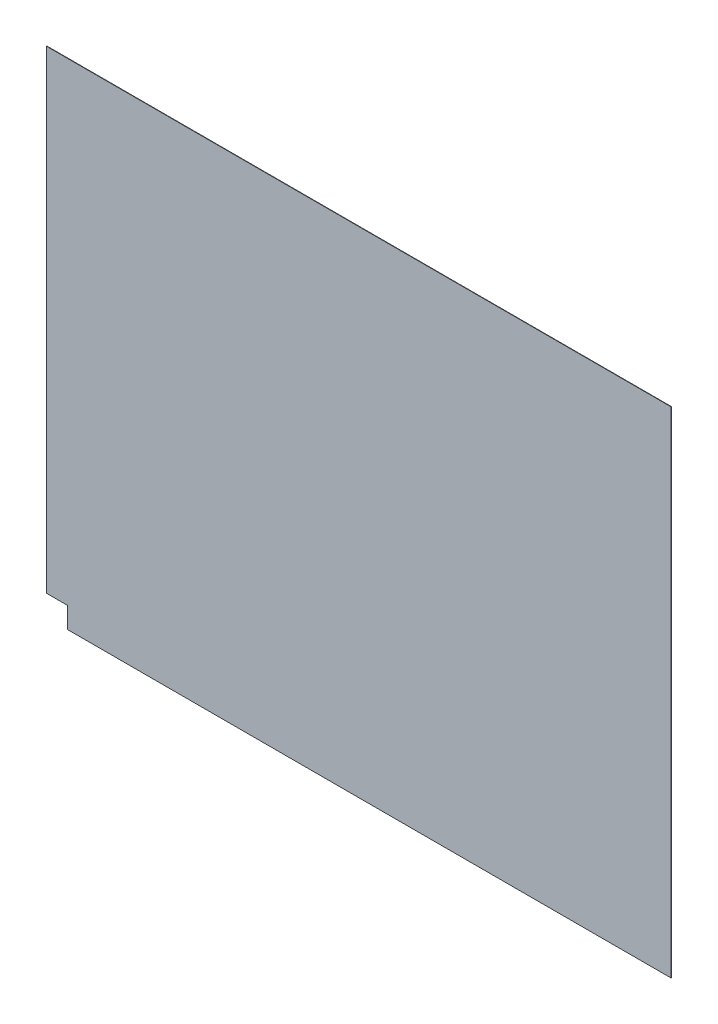
ISO-10303-21;
HEADER;
FILE_DESCRIPTION(('STEP AP214'),'2;1');
FILE_NAME('part.step','',(''),(''),'','','');
FILE_SCHEMA(('AUTOMOTIVE_DESIGN { 1 0 10303 214 1 1 1 1 }'));
ENDSEC;
DATA;
#1=APPLICATION_CONTEXT('core data for automotive mechanical design processes');
#2=APPLICATION_PROTOCOL_DEFINITION('international standard','automotive_design',2000,#1);
#3=PRODUCT_CONTEXT('',#1,'mechanical');
#4=PRODUCT('Part','Part','',(#3));
#5=PRODUCT_RELATED_PRODUCT_CATEGORY('part','',(#4));
#6=PRODUCT_DEFINITION_FORMATION('','',#4);
#7=PRODUCT_DEFINITION_CONTEXT('part definition',#1,'design');
#8=PRODUCT_DEFINITION('design','',#6,#7);
#9=PRODUCT_DEFINITION_SHAPE('','',#8);
#10=(LENGTH_UNIT() NAMED_UNIT(*) SI_UNIT(.MILLI.,.METRE.));
#11=(NAMED_UNIT(*) PLANE_ANGLE_UNIT() SI_UNIT($,.RADIAN.));
#12=(NAMED_UNIT(*) SI_UNIT($,.STERADIAN.) SOLID_ANGLE_UNIT());
#13=UNCERTAINTY_MEASURE_WITH_UNIT(LENGTH_MEASURE(1.E-05),#10,'distance_accuracy_value','');
#14=(GEOMETRIC_REPRESENTATION_CONTEXT(3) GLOBAL_UNCERTAINTY_ASSIGNED_CONTEXT((#13)) GLOBAL_UNIT_ASSIGNED_CONTEXT((#10,
#11,#12)) REPRESENTATION_CONTEXT('',''));
#15=CARTESIAN_POINT('',(0.,0.,0.));
#16=DIRECTION('',(0.,0.,1.));
#17=DIRECTION('',(1.,0.,0.));
#18=AXIS2_PLACEMENT_3D('',#15,#16,#17);
#19=CARTESIAN_POINT('',(597.2,-473.,-0.8));
#20=DIRECTION('',(1.,0.,0.));
#21=DIRECTION('',(0.,0.,-1.));
#22=AXIS2_PLACEMENT_3D('',#19,#20,#21);
#23=PLANE('',#22);
#24=DIRECTION('',(0.,1.,0.));
#25=VECTOR('',#24,1.);
#26=CARTESIAN_POINT('',(597.2,-473.,0.));
#27=LINE('',#26,#25);
#28=CARTESIAN_POINT('',(597.2,-473.,0.));
#29=VERTEX_POINT('',#28);
#30=CARTESIAN_POINT('',(597.2,473.,0.));
#31=VERTEX_POINT('',#30);
#32=EDGE_CURVE('E120',#29,#31,#27,.T.);
#33=ORIENTED_EDGE('',*,*,#32,.F.);
#34=DIRECTION('',(0.,0.,1.));
#35=VECTOR('',#34,1.);
#36=CARTESIAN_POINT('',(597.2,-473.,-0.8));
#37=LINE('',#36,#35);
#38=CARTESIAN_POINT('',(597.2,-473.,-0.8));
#39=VERTEX_POINT('',#38);
#40=EDGE_CURVE('E129',#39,#29,#37,.T.);
#41=ORIENTED_EDGE('',*,*,#40,.F.);
#42=DIRECTION('',(0.,1.,0.));
#43=VECTOR('',#42,1.);
#44=CARTESIAN_POINT('',(597.2,-473.,-0.8));
#45=LINE('',#44,#43);
#46=CARTESIAN_POINT('',(597.2,473.,-0.8));
#47=VERTEX_POINT('',#46);
#48=EDGE_CURVE('E116',#39,#47,#45,.T.);
#49=ORIENTED_EDGE('',*,*,#48,.T.);
#50=DIRECTION('',(0.,0.,1.));
#51=VECTOR('',#50,1.);
#52=CARTESIAN_POINT('',(597.2,473.,-0.8));
#53=LINE('',#52,#51);
#54=EDGE_CURVE('E79',#47,#31,#53,.T.);
#55=ORIENTED_EDGE('',*,*,#54,.T.);
#56=EDGE_LOOP('',(#33,#41,#49,#55));
#57=FACE_BOUND('',#56,.T.);
#58=ADVANCED_FACE('F33',(#57),#23,.T.);
#59=CARTESIAN_POINT('',(-597.2,-473.,-0.8));
#60=DIRECTION('',(0.,-1.,0.));
#61=DIRECTION('',(0.,0.,-1.));
#62=AXIS2_PLACEMENT_3D('',#59,#60,#61);
#63=PLANE('',#62);
#64=DIRECTION('',(0.,0.,-1.));
#65=VECTOR('',#64,1.);
#66=CARTESIAN_POINT('',(-557.2,-473.,9.2));
#67=LINE('',#66,#65);
#68=CARTESIAN_POINT('',(-557.2,-473.,0.));
#69=VERTEX_POINT('',#68);
#70=CARTESIAN_POINT('',(-557.2,-473.,-0.8));
#71=VERTEX_POINT('',#70);
#72=EDGE_CURVE('E123',#69,#71,#67,.T.);
#73=ORIENTED_EDGE('',*,*,#72,.T.);
#74=DIRECTION('',(1.,0.,0.));
#75=VECTOR('',#74,1.);
#76=CARTESIAN_POINT('',(-597.2,-473.,-0.8));
#77=LINE('',#76,#75);
#78=EDGE_CURVE('E56',#71,#39,#77,.T.);
#79=ORIENTED_EDGE('',*,*,#78,.T.);
#80=ORIENTED_EDGE('',*,*,#40,.T.);
#81=DIRECTION('',(1.,0.,0.));
#82=VECTOR('',#81,1.);
#83=CARTESIAN_POINT('',(-597.2,-473.,0.));
#84=LINE('',#83,#82);
#85=EDGE_CURVE('E74',#69,#29,#84,.T.);
#86=ORIENTED_EDGE('',*,*,#85,.F.);
#87=EDGE_LOOP('',(#73,#79,#80,#86));
#88=FACE_BOUND('',#87,.T.);
#89=ADVANCED_FACE('F143',(#88),#63,.T.);
#90=CARTESIAN_POINT('',(-597.2,-473.,-0.8));
#91=DIRECTION('',(-1.,0.,0.));
#92=DIRECTION('',(0.,0.,1.));
#93=AXIS2_PLACEMENT_3D('',#90,#91,#92);
#94=PLANE('',#93);
#95=DIRECTION('',(0.,0.,-1.));
#96=VECTOR('',#95,1.);
#97=CARTESIAN_POINT('',(-597.2,-433.,9.2));
#98=LINE('',#97,#96);
#99=CARTESIAN_POINT('',(-597.2,-433.,0.));
#100=VERTEX_POINT('',#99);
#101=CARTESIAN_POINT('',(-597.2,-433.,-0.8));
#102=VERTEX_POINT('',#101);
#103=EDGE_CURVE('E94',#100,#102,#98,.T.);
#104=ORIENTED_EDGE('',*,*,#103,.F.);
#105=DIRECTION('',(0.,-1.,0.));
#106=VECTOR('',#105,1.);
#107=CARTESIAN_POINT('',(-597.2,-473.,0.));
#108=LINE('',#107,#106);
#109=CARTESIAN_POINT('',(-597.2,473.,0.));
#110=VERTEX_POINT('',#109);
#111=EDGE_CURVE('E126',#110,#100,#108,.T.);
#112=ORIENTED_EDGE('',*,*,#111,.F.);
#113=DIRECTION('',(0.,0.,1.));
#114=VECTOR('',#113,1.);
#115=CARTESIAN_POINT('',(-597.2,473.,-0.8));
#116=LINE('',#115,#114);
#117=CARTESIAN_POINT('',(-597.2,473.,-0.8));
#118=VERTEX_POINT('',#117);
#119=EDGE_CURVE('E112',#118,#110,#116,.T.);
#120=ORIENTED_EDGE('',*,*,#119,.F.);
#121=DIRECTION('',(0.,-1.,0.));
#122=VECTOR('',#121,1.);
#123=CARTESIAN_POINT('',(-597.2,-473.,-0.8));
#124=LINE('',#123,#122);
#125=EDGE_CURVE('E109',#118,#102,#124,.T.);
#126=ORIENTED_EDGE('',*,*,#125,.T.);
#127=EDGE_LOOP('',(#104,#112,#120,#126));
#128=FACE_BOUND('',#127,.T.);
#129=ADVANCED_FACE('F111',(#128),#94,.T.);
#130=CARTESIAN_POINT('',(-597.2,473.,-0.8));
#131=DIRECTION('',(0.,1.,0.));
#132=DIRECTION('',(0.,0.,1.));
#133=AXIS2_PLACEMENT_3D('',#130,#131,#132);
#134=PLANE('',#133);
#135=DIRECTION('',(-1.,0.,0.));
#136=VECTOR('',#135,1.);
#137=CARTESIAN_POINT('',(-597.2,473.,0.));
#138=LINE('',#137,#136);
#139=EDGE_CURVE('E122',#31,#110,#138,.T.);
#140=ORIENTED_EDGE('',*,*,#139,.F.);
#141=ORIENTED_EDGE('',*,*,#54,.F.);
#142=DIRECTION('',(-1.,0.,0.));
#143=VECTOR('',#142,1.);
#144=CARTESIAN_POINT('',(-597.2,473.,-0.8));
#145=LINE('',#144,#143);
#146=EDGE_CURVE('E113',#47,#118,#145,.T.);
#147=ORIENTED_EDGE('',*,*,#146,.T.);
#148=ORIENTED_EDGE('',*,*,#119,.T.);
#149=EDGE_LOOP('',(#140,#141,#147,#148));
#150=FACE_BOUND('',#149,.T.);
#151=ADVANCED_FACE('F134',(#150),#134,.T.);
#152=CARTESIAN_POINT('',(597.2,473.,-0.8));
#153=DIRECTION('',(0.,0.,-1.));
#154=DIRECTION('',(-1.,0.,0.));
#155=AXIS2_PLACEMENT_3D('',#152,#153,#154);
#156=PLANE('',#155);
#157=DIRECTION('',(0.,-1.,0.));
#158=VECTOR('',#157,1.);
#159=CARTESIAN_POINT('',(-557.2,-473.,-0.8));
#160=LINE('',#159,#158);
#161=CARTESIAN_POINT('',(-557.2,-433.,-0.8));
#162=VERTEX_POINT('',#161);
#163=EDGE_CURVE('E104',#162,#71,#160,.T.);
#164=ORIENTED_EDGE('',*,*,#163,.F.);
#165=DIRECTION('',(1.,0.,0.));
#166=VECTOR('',#165,1.);
#167=CARTESIAN_POINT('',(-597.2,-433.,-0.8));
#168=LINE('',#167,#166);
#169=EDGE_CURVE('E97',#102,#162,#168,.T.);
#170=ORIENTED_EDGE('',*,*,#169,.F.);
#171=ORIENTED_EDGE('',*,*,#125,.F.);
#172=ORIENTED_EDGE('',*,*,#146,.F.);
#173=ORIENTED_EDGE('',*,*,#48,.F.);
#174=ORIENTED_EDGE('',*,*,#78,.F.);
#175=EDGE_LOOP('',(#164,#170,#171,#172,#173,#174));
#176=FACE_BOUND('',#175,.T.);
#177=ADVANCED_FACE('F108',(#176),#156,.T.);
#178=CARTESIAN_POINT('',(597.2,473.,0.));
#179=DIRECTION('',(0.,0.,-1.));
#180=DIRECTION('',(-1.,0.,0.));
#181=AXIS2_PLACEMENT_3D('',#178,#179,#180);
#182=PLANE('',#181);
#183=DIRECTION('',(1.,0.,0.));
#184=VECTOR('',#183,1.);
#185=CARTESIAN_POINT('',(597.2,-433.,0.));
#186=LINE('',#185,#184);
#187=CARTESIAN_POINT('',(-557.2,-433.,0.));
#188=VERTEX_POINT('',#187);
#189=EDGE_CURVE('E40',#100,#188,#186,.T.);
#190=ORIENTED_EDGE('',*,*,#189,.T.);
#191=DIRECTION('',(0.,-1.,0.));
#192=VECTOR('',#191,1.);
#193=CARTESIAN_POINT('',(-557.2,473.,0.));
#194=LINE('',#193,#192);
#195=EDGE_CURVE('E11',#188,#69,#194,.T.);
#196=ORIENTED_EDGE('',*,*,#195,.T.);
#197=ORIENTED_EDGE('',*,*,#85,.T.);
#198=ORIENTED_EDGE('',*,*,#32,.T.);
#199=ORIENTED_EDGE('',*,*,#139,.T.);
#200=ORIENTED_EDGE('',*,*,#111,.T.);
#201=EDGE_LOOP('',(#190,#196,#197,#198,#199,#200));
#202=FACE_BOUND('',#201,.T.);
#203=ADVANCED_FACE('F132',(#202),#182,.F.);
#204=CARTESIAN_POINT('',(-557.2,-473.,9.2));
#205=DIRECTION('',(1.,0.,0.));
#206=DIRECTION('',(0.,0.,-1.));
#207=AXIS2_PLACEMENT_3D('',#204,#205,#206);
#208=PLANE('',#207);
#209=DIRECTION('',(0.,0.,-1.));
#210=VECTOR('',#209,1.);
#211=CARTESIAN_POINT('',(-557.2,-433.,9.2));
#212=LINE('',#211,#210);
#213=EDGE_CURVE('E47',#188,#162,#212,.T.);
#214=ORIENTED_EDGE('',*,*,#213,.T.);
#215=ORIENTED_EDGE('',*,*,#163,.T.);
#216=ORIENTED_EDGE('',*,*,#72,.F.);
#217=ORIENTED_EDGE('',*,*,#195,.F.);
#218=EDGE_LOOP('',(#214,#215,#216,#217));
#219=FACE_BOUND('',#218,.T.);
#220=ADVANCED_FACE('F142',(#219),#208,.F.);
#221=CARTESIAN_POINT('',(-597.2,-433.,9.2));
#222=DIRECTION('',(0.,1.,0.));
#223=DIRECTION('',(0.,0.,1.));
#224=AXIS2_PLACEMENT_3D('',#221,#222,#223);
#225=PLANE('',#224);
#226=ORIENTED_EDGE('',*,*,#103,.T.);
#227=ORIENTED_EDGE('',*,*,#169,.T.);
#228=ORIENTED_EDGE('',*,*,#213,.F.);
#229=ORIENTED_EDGE('',*,*,#189,.F.);
#230=EDGE_LOOP('',(#226,#227,#228,#229));
#231=FACE_BOUND('',#230,.T.);
#232=ADVANCED_FACE('F96',(#231),#225,.F.);
#233=CLOSED_SHELL('',(#58,#89,#129,#151,#177,#203,#220,#232));
#234=MANIFOLD_SOLID_BREP('B2',#233);
#235=ADVANCED_BREP_SHAPE_REPRESENTATION('',(#18,#234),#14);
#236=SHAPE_DEFINITION_REPRESENTATION(#9,#235);
ENDSEC;
END-ISO-10303-21;
